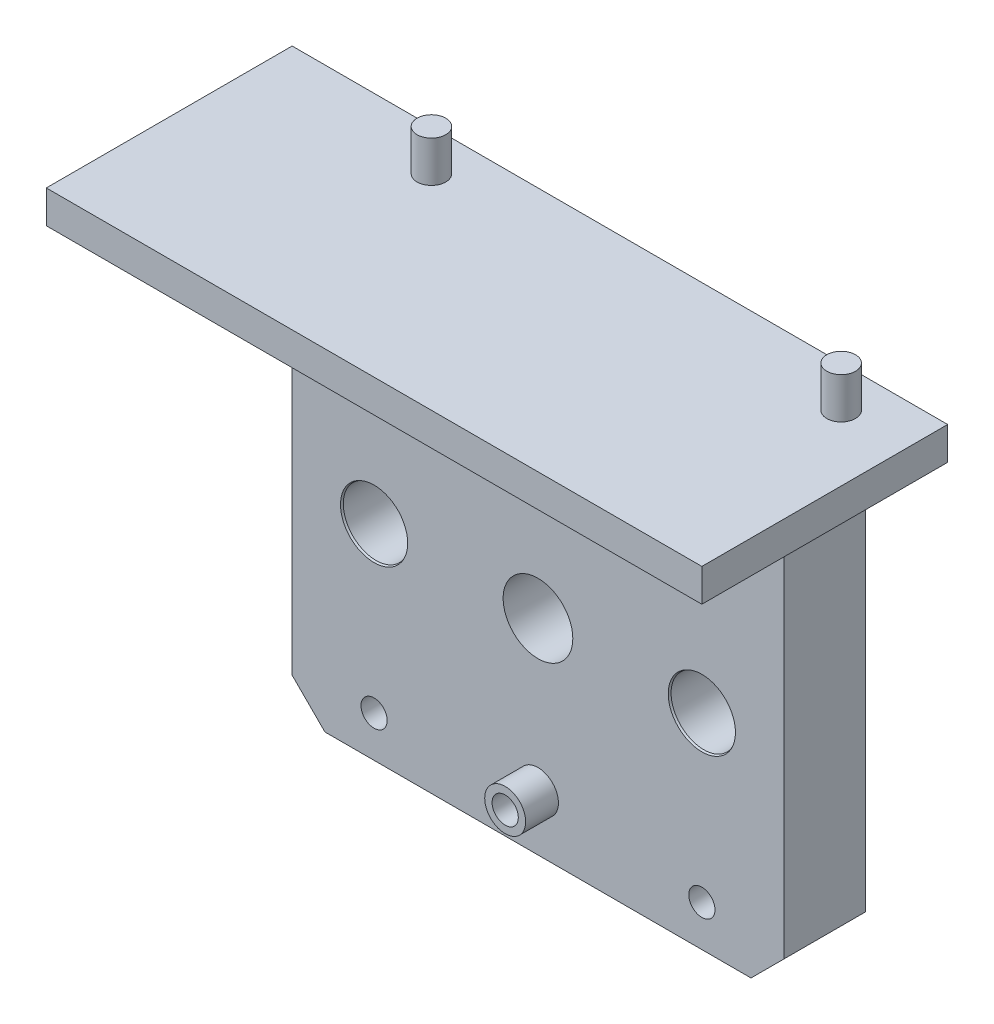
ISO-10303-21;
HEADER;
FILE_DESCRIPTION(('STEP AP214'),'2;1');
FILE_NAME('part.step','',(''),(''),'','','');
FILE_SCHEMA(('AUTOMOTIVE_DESIGN { 1 0 10303 214 1 1 1 1 }'));
ENDSEC;
DATA;
#1=APPLICATION_CONTEXT('core data for automotive mechanical design processes');
#2=APPLICATION_PROTOCOL_DEFINITION('international standard','automotive_design',2000,#1);
#3=PRODUCT_CONTEXT('',#1,'mechanical');
#4=PRODUCT('Part','Part','',(#3));
#5=PRODUCT_RELATED_PRODUCT_CATEGORY('part','',(#4));
#6=PRODUCT_DEFINITION_FORMATION('','',#4);
#7=PRODUCT_DEFINITION_CONTEXT('part definition',#1,'design');
#8=PRODUCT_DEFINITION('design','',#6,#7);
#9=PRODUCT_DEFINITION_SHAPE('','',#8);
#10=(LENGTH_UNIT() NAMED_UNIT(*) SI_UNIT(.MILLI.,.METRE.));
#11=(NAMED_UNIT(*) PLANE_ANGLE_UNIT() SI_UNIT($,.RADIAN.));
#12=(NAMED_UNIT(*) SI_UNIT($,.STERADIAN.) SOLID_ANGLE_UNIT());
#13=UNCERTAINTY_MEASURE_WITH_UNIT(LENGTH_MEASURE(1.E-05),#10,'distance_accuracy_value','');
#14=(GEOMETRIC_REPRESENTATION_CONTEXT(3) GLOBAL_UNCERTAINTY_ASSIGNED_CONTEXT((#13)) GLOBAL_UNIT_ASSIGNED_CONTEXT((#10,
#11,#12)) REPRESENTATION_CONTEXT('',''));
#15=CARTESIAN_POINT('',(0.,0.,0.));
#16=DIRECTION('',(0.,0.,1.));
#17=DIRECTION('',(1.,0.,0.));
#18=AXIS2_PLACEMENT_3D('',#15,#16,#17);
#19=CARTESIAN_POINT('',(0.,0.,10.));
#20=DIRECTION('',(0.,0.,-1.));
#21=DIRECTION('',(-1.,0.,0.));
#22=AXIS2_PLACEMENT_3D('',#19,#20,#21);
#23=PLANE('',#22);
#24=CARTESIAN_POINT('',(20.,-20.0000000000002,10.));
#25=DIRECTION('',(0.,0.,1.));
#26=DIRECTION('',(1.,0.,0.));
#27=AXIS2_PLACEMENT_3D('',#24,#25,#26);
#28=CIRCLE('',#27,1.6);
#29=CARTESIAN_POINT('',(21.6,-20.0000000000002,10.));
#30=VERTEX_POINT('',#29);
#31=EDGE_CURVE('E180',#30,#30,#28,.T.);
#32=ORIENTED_EDGE('',*,*,#31,.F.);
#33=EDGE_LOOP('',(#32));
#34=FACE_BOUND('',#33,.T.);
#35=CARTESIAN_POINT('',(-20.,20.0000000000002,10.));
#36=DIRECTION('',(0.,0.,1.));
#37=DIRECTION('',(1.,0.,0.));
#38=AXIS2_PLACEMENT_3D('',#35,#36,#37);
#39=CIRCLE('',#38,1.6);
#40=CARTESIAN_POINT('',(-18.4,20.0000000000002,10.));
#41=VERTEX_POINT('',#40);
#42=EDGE_CURVE('E176',#41,#41,#39,.T.);
#43=ORIENTED_EDGE('',*,*,#42,.F.);
#44=EDGE_LOOP('',(#43));
#45=FACE_BOUND('',#44,.T.);
#46=CARTESIAN_POINT('',(0.,-18.25,10.));
#47=DIRECTION('',(0.,0.,-1.));
#48=DIRECTION('',(-1.,0.,0.));
#49=AXIS2_PLACEMENT_3D('',#46,#47,#48);
#50=CIRCLE('',#49,2.5);
#51=CARTESIAN_POINT('',(-2.5,-18.25,10.));
#52=VERTEX_POINT('',#51);
#53=EDGE_CURVE('E254',#52,#52,#50,.F.);
#54=ORIENTED_EDGE('',*,*,#53,.F.);
#55=EDGE_LOOP('',(#54));
#56=FACE_BOUND('',#55,.T.);
#57=CARTESIAN_POINT('',(0.,18.25,10.));
#58=DIRECTION('',(0.,0.,-1.));
#59=DIRECTION('',(-1.,0.,0.));
#60=AXIS2_PLACEMENT_3D('',#57,#58,#59);
#61=CIRCLE('',#60,2.5);
#62=CARTESIAN_POINT('',(-2.5,18.25,10.));
#63=VERTEX_POINT('',#62);
#64=EDGE_CURVE('E246',#63,#63,#61,.F.);
#65=ORIENTED_EDGE('',*,*,#64,.F.);
#66=EDGE_LOOP('',(#65));
#67=FACE_BOUND('',#66,.T.);
#68=CARTESIAN_POINT('',(20.,0.,10.));
#69=DIRECTION('',(0.,0.,1.));
#70=DIRECTION('',(1.,0.,0.));
#71=AXIS2_PLACEMENT_3D('',#68,#69,#70);
#72=CIRCLE('',#71,4.1);
#73=CARTESIAN_POINT('',(24.1,0.,10.));
#74=VERTEX_POINT('',#73);
#75=EDGE_CURVE('E214',#74,#74,#72,.T.);
#76=ORIENTED_EDGE('',*,*,#75,.F.);
#77=EDGE_LOOP('',(#76));
#78=FACE_BOUND('',#77,.T.);
#79=CARTESIAN_POINT('',(-20.,0.,10.));
#80=DIRECTION('',(0.,0.,1.));
#81=DIRECTION('',(1.,0.,0.));
#82=AXIS2_PLACEMENT_3D('',#79,#80,#81);
#83=CIRCLE('',#82,4.1);
#84=CARTESIAN_POINT('',(-15.9,0.,10.));
#85=VERTEX_POINT('',#84);
#86=EDGE_CURVE('E223',#85,#85,#83,.T.);
#87=ORIENTED_EDGE('',*,*,#86,.F.);
#88=EDGE_LOOP('',(#87));
#89=FACE_BOUND('',#88,.T.);
#90=CARTESIAN_POINT('',(0.,0.,10.));
#91=DIRECTION('',(0.,0.,1.));
#92=DIRECTION('',(1.,0.,0.));
#93=AXIS2_PLACEMENT_3D('',#90,#91,#92);
#94=CIRCLE('',#93,4.25000000000002);
#95=CARTESIAN_POINT('',(4.25000000000002,0.,10.));
#96=VERTEX_POINT('',#95);
#97=EDGE_CURVE('E232',#96,#96,#94,.T.);
#98=ORIENTED_EDGE('',*,*,#97,.F.);
#99=EDGE_LOOP('',(#98));
#100=FACE_BOUND('',#99,.T.);
#101=DIRECTION('',(0.,1.,0.));
#102=VECTOR('',#101,1.);
#103=CARTESIAN_POINT('',(30.,-25.,10.));
#104=LINE('',#103,#102);
#105=CARTESIAN_POINT('',(30.,-21.,10.));
#106=VERTEX_POINT('',#105);
#107=CARTESIAN_POINT('',(30.,31.5,10.));
#108=VERTEX_POINT('',#107);
#109=EDGE_CURVE('E239',#106,#108,#104,.T.);
#110=ORIENTED_EDGE('',*,*,#109,.T.);
#111=DIRECTION('',(-1.,0.,0.));
#112=VECTOR('',#111,1.);
#113=CARTESIAN_POINT('',(0.,31.5,10.));
#114=LINE('',#113,#112);
#115=CARTESIAN_POINT('',(-30.,31.5,10.));
#116=VERTEX_POINT('',#115);
#117=EDGE_CURVE('E161',#108,#116,#114,.T.);
#118=ORIENTED_EDGE('',*,*,#117,.T.);
#119=DIRECTION('',(0.,-1.,0.));
#120=VECTOR('',#119,1.);
#121=CARTESIAN_POINT('',(-30.,-25.,10.));
#122=LINE('',#121,#120);
#123=CARTESIAN_POINT('',(-30.,-21.,10.));
#124=VERTEX_POINT('',#123);
#125=EDGE_CURVE('E53',#116,#124,#122,.T.);
#126=ORIENTED_EDGE('',*,*,#125,.T.);
#127=DIRECTION('',(-0.707106781186546,0.707106781186549,0.));
#128=VECTOR('',#127,1.);
#129=CARTESIAN_POINT('',(-26.,-25.,10.));
#130=LINE('',#129,#128);
#131=CARTESIAN_POINT('',(-26.,-25.,10.));
#132=VERTEX_POINT('',#131);
#133=EDGE_CURVE('E269',#124,#132,#130,.F.);
#134=ORIENTED_EDGE('',*,*,#133,.T.);
#135=DIRECTION('',(1.,0.,0.));
#136=VECTOR('',#135,1.);
#137=CARTESIAN_POINT('',(-30.,-25.,10.));
#138=LINE('',#137,#136);
#139=CARTESIAN_POINT('',(26.,-25.,10.));
#140=VERTEX_POINT('',#139);
#141=EDGE_CURVE('E244',#132,#140,#138,.T.);
#142=ORIENTED_EDGE('',*,*,#141,.T.);
#143=DIRECTION('',(-0.707106781186549,-0.707106781186546,0.));
#144=VECTOR('',#143,1.);
#145=CARTESIAN_POINT('',(30.,-21.,10.));
#146=LINE('',#145,#144);
#147=EDGE_CURVE('E271',#140,#106,#146,.F.);
#148=ORIENTED_EDGE('',*,*,#147,.T.);
#149=EDGE_LOOP('',(#110,#118,#126,#134,#142,#148));
#150=FACE_BOUND('',#149,.T.);
#151=CARTESIAN_POINT('',(20.,20.0000000000002,10.));
#152=DIRECTION('',(0.,0.,1.));
#153=DIRECTION('',(1.,0.,0.));
#154=AXIS2_PLACEMENT_3D('',#151,#152,#153);
#155=CIRCLE('',#154,1.6);
#156=CARTESIAN_POINT('',(21.6,20.0000000000002,10.));
#157=VERTEX_POINT('',#156);
#158=EDGE_CURVE('E173',#157,#157,#155,.F.);
#159=ORIENTED_EDGE('',*,*,#158,.T.);
#160=EDGE_LOOP('',(#159));
#161=FACE_BOUND('',#160,.T.);
#162=CARTESIAN_POINT('',(-20.,-20.0000000000002,10.));
#163=DIRECTION('',(0.,0.,-1.));
#164=DIRECTION('',(-1.,0.,0.));
#165=AXIS2_PLACEMENT_3D('',#162,#163,#164);
#166=CIRCLE('',#165,1.6);
#167=CARTESIAN_POINT('',(-21.6,-20.0000000000002,10.));
#168=VERTEX_POINT('',#167);
#169=EDGE_CURVE('E186',#168,#168,#166,.T.);
#170=ORIENTED_EDGE('',*,*,#169,.T.);
#171=EDGE_LOOP('',(#170));
#172=FACE_BOUND('',#171,.T.);
#173=ADVANCED_FACE('F37',(#34,#45,#56,#67,#78,#89,#100,#150,#161,#172),#23,.F.);
#174=CARTESIAN_POINT('',(0.,0.,0.));
#175=DIRECTION('',(0.,0.,-1.));
#176=DIRECTION('',(-1.,0.,0.));
#177=AXIS2_PLACEMENT_3D('',#174,#175,#176);
#178=PLANE('',#177);
#179=DIRECTION('',(0.,-1.,0.));
#180=VECTOR('',#179,1.);
#181=CARTESIAN_POINT('',(-30.,-25.,0.));
#182=LINE('',#181,#180);
#183=CARTESIAN_POINT('',(-30.,31.5,0.));
#184=VERTEX_POINT('',#183);
#185=CARTESIAN_POINT('',(-30.,-21.,0.));
#186=VERTEX_POINT('',#185);
#187=EDGE_CURVE('E249',#184,#186,#182,.T.);
#188=ORIENTED_EDGE('',*,*,#187,.F.);
#189=DIRECTION('',(-1.,0.,0.));
#190=VECTOR('',#189,1.);
#191=CARTESIAN_POINT('',(40.,31.5,0.));
#192=LINE('',#191,#190);
#193=CARTESIAN_POINT('',(-40.,31.5,0.));
#194=VERTEX_POINT('',#193);
#195=EDGE_CURVE('E153',#184,#194,#192,.T.);
#196=ORIENTED_EDGE('',*,*,#195,.T.);
#197=DIRECTION('',(0.,1.,0.));
#198=VECTOR('',#197,1.);
#199=CARTESIAN_POINT('',(-40.,31.5,0.));
#200=LINE('',#199,#198);
#201=CARTESIAN_POINT('',(-40.,35.5,0.));
#202=VERTEX_POINT('',#201);
#203=EDGE_CURVE('E143',#194,#202,#200,.T.);
#204=ORIENTED_EDGE('',*,*,#203,.T.);
#205=DIRECTION('',(-1.,0.,0.));
#206=VECTOR('',#205,1.);
#207=CARTESIAN_POINT('',(30.,35.5,0.));
#208=LINE('',#207,#206);
#209=CARTESIAN_POINT('',(40.,35.5,0.));
#210=VERTEX_POINT('',#209);
#211=EDGE_CURVE('E170',#210,#202,#208,.T.);
#212=ORIENTED_EDGE('',*,*,#211,.F.);
#213=DIRECTION('',(0.,1.,0.));
#214=VECTOR('',#213,1.);
#215=CARTESIAN_POINT('',(40.,31.5,0.));
#216=LINE('',#215,#214);
#217=CARTESIAN_POINT('',(40.,31.5,0.));
#218=VERTEX_POINT('',#217);
#219=EDGE_CURVE('E162',#218,#210,#216,.T.);
#220=ORIENTED_EDGE('',*,*,#219,.F.);
#221=CARTESIAN_POINT('',(30.,31.5,0.));
#222=VERTEX_POINT('',#221);
#223=EDGE_CURVE('E129',#218,#222,#192,.T.);
#224=ORIENTED_EDGE('',*,*,#223,.T.);
#225=DIRECTION('',(0.,1.,0.));
#226=VECTOR('',#225,1.);
#227=CARTESIAN_POINT('',(30.,-25.,0.));
#228=LINE('',#227,#226);
#229=CARTESIAN_POINT('',(30.,-21.,0.));
#230=VERTEX_POINT('',#229);
#231=EDGE_CURVE('E238',#230,#222,#228,.T.);
#232=ORIENTED_EDGE('',*,*,#231,.F.);
#233=DIRECTION('',(0.707106781186549,0.707106781186546,0.));
#234=VECTOR('',#233,1.);
#235=CARTESIAN_POINT('',(25.4999999999999,-25.5,0.));
#236=LINE('',#235,#234);
#237=CARTESIAN_POINT('',(26.,-25.,0.));
#238=VERTEX_POINT('',#237);
#239=EDGE_CURVE('E263',#230,#238,#236,.F.);
#240=ORIENTED_EDGE('',*,*,#239,.T.);
#241=DIRECTION('',(1.,0.,0.));
#242=VECTOR('',#241,1.);
#243=CARTESIAN_POINT('',(-30.,-25.,0.));
#244=LINE('',#243,#242);
#245=CARTESIAN_POINT('',(-26.,-25.,0.));
#246=VERTEX_POINT('',#245);
#247=EDGE_CURVE('E242',#246,#238,#244,.T.);
#248=ORIENTED_EDGE('',*,*,#247,.F.);
#249=DIRECTION('',(0.707106781186546,-0.707106781186549,0.));
#250=VECTOR('',#249,1.);
#251=CARTESIAN_POINT('',(-25.5000000000001,-25.5,0.));
#252=LINE('',#251,#250);
#253=EDGE_CURVE('E260',#246,#186,#252,.F.);
#254=ORIENTED_EDGE('',*,*,#253,.T.);
#255=EDGE_LOOP('',(#188,#196,#204,#212,#220,#224,#232,#240,#248,#254));
#256=FACE_BOUND('',#255,.T.);
#257=CARTESIAN_POINT('',(20.,20.0000000000002,0.));
#258=DIRECTION('',(0.,0.,1.));
#259=DIRECTION('',(1.,0.,0.));
#260=AXIS2_PLACEMENT_3D('',#257,#258,#259);
#261=CIRCLE('',#260,1.6);
#262=CARTESIAN_POINT('',(21.6,20.0000000000002,0.));
#263=VERTEX_POINT('',#262);
#264=EDGE_CURVE('E177',#263,#263,#261,.F.);
#265=ORIENTED_EDGE('',*,*,#264,.F.);
#266=EDGE_LOOP('',(#265));
#267=FACE_BOUND('',#266,.T.);
#268=CARTESIAN_POINT('',(-20.,20.0000000000002,0.));
#269=DIRECTION('',(0.,0.,1.));
#270=DIRECTION('',(1.,0.,0.));
#271=AXIS2_PLACEMENT_3D('',#268,#269,#270);
#272=CIRCLE('',#271,1.6);
#273=CARTESIAN_POINT('',(-18.4,20.0000000000002,0.));
#274=VERTEX_POINT('',#273);
#275=EDGE_CURVE('E191',#274,#274,#272,.T.);
#276=ORIENTED_EDGE('',*,*,#275,.T.);
#277=EDGE_LOOP('',(#276));
#278=FACE_BOUND('',#277,.T.);
#279=CARTESIAN_POINT('',(0.,18.25,0.));
#280=DIRECTION('',(0.,0.,1.));
#281=DIRECTION('',(1.,0.,0.));
#282=AXIS2_PLACEMENT_3D('',#279,#280,#281);
#283=CIRCLE('',#282,1.60000000000001);
#284=CARTESIAN_POINT('',(1.60000000000001,18.25,0.));
#285=VERTEX_POINT('',#284);
#286=EDGE_CURVE('E199',#285,#285,#283,.T.);
#287=ORIENTED_EDGE('',*,*,#286,.T.);
#288=EDGE_LOOP('',(#287));
#289=FACE_BOUND('',#288,.T.);
#290=CARTESIAN_POINT('',(0.,-18.25,0.));
#291=DIRECTION('',(0.,0.,1.));
#292=DIRECTION('',(1.,0.,0.));
#293=AXIS2_PLACEMENT_3D('',#290,#291,#292);
#294=CIRCLE('',#293,1.60000000000001);
#295=CARTESIAN_POINT('',(1.60000000000001,-18.25,0.));
#296=VERTEX_POINT('',#295);
#297=EDGE_CURVE('E205',#296,#296,#294,.T.);
#298=ORIENTED_EDGE('',*,*,#297,.T.);
#299=EDGE_LOOP('',(#298));
#300=FACE_BOUND('',#299,.T.);
#301=CARTESIAN_POINT('',(20.,0.,0.));
#302=DIRECTION('',(0.,0.,1.));
#303=DIRECTION('',(1.,0.,0.));
#304=AXIS2_PLACEMENT_3D('',#301,#302,#303);
#305=CIRCLE('',#304,4.);
#306=CARTESIAN_POINT('',(24.,0.,0.));
#307=VERTEX_POINT('',#306);
#308=EDGE_CURVE('E220',#307,#307,#305,.T.);
#309=ORIENTED_EDGE('',*,*,#308,.T.);
#310=EDGE_LOOP('',(#309));
#311=FACE_BOUND('',#310,.T.);
#312=CARTESIAN_POINT('',(-20.,0.,0.));
#313=DIRECTION('',(0.,0.,1.));
#314=DIRECTION('',(1.,0.,0.));
#315=AXIS2_PLACEMENT_3D('',#312,#313,#314);
#316=CIRCLE('',#315,4.);
#317=CARTESIAN_POINT('',(-16.,0.,0.));
#318=VERTEX_POINT('',#317);
#319=EDGE_CURVE('E229',#318,#318,#316,.T.);
#320=ORIENTED_EDGE('',*,*,#319,.T.);
#321=EDGE_LOOP('',(#320));
#322=FACE_BOUND('',#321,.T.);
#323=CARTESIAN_POINT('',(0.,0.,0.));
#324=DIRECTION('',(0.,0.,-1.));
#325=DIRECTION('',(-1.,0.,0.));
#326=AXIS2_PLACEMENT_3D('',#323,#324,#325);
#327=CIRCLE('',#326,4.25000000000001);
#328=CARTESIAN_POINT('',(-4.25000000000001,0.,0.));
#329=VERTEX_POINT('',#328);
#330=EDGE_CURVE('E235',#329,#329,#327,.T.);
#331=ORIENTED_EDGE('',*,*,#330,.F.);
#332=EDGE_LOOP('',(#331));
#333=FACE_BOUND('',#332,.T.);
#334=CARTESIAN_POINT('',(20.,-20.0000000000002,0.));
#335=DIRECTION('',(0.,0.,1.));
#336=DIRECTION('',(1.,0.,0.));
#337=AXIS2_PLACEMENT_3D('',#334,#335,#336);
#338=CIRCLE('',#337,1.6);
#339=CARTESIAN_POINT('',(21.6,-20.0000000000002,0.));
#340=VERTEX_POINT('',#339);
#341=EDGE_CURVE('E183',#340,#340,#338,.T.);
#342=ORIENTED_EDGE('',*,*,#341,.T.);
#343=EDGE_LOOP('',(#342));
#344=FACE_BOUND('',#343,.T.);
#345=CARTESIAN_POINT('',(-20.,-20.0000000000002,0.));
#346=DIRECTION('',(0.,0.,-1.));
#347=DIRECTION('',(-1.,0.,0.));
#348=AXIS2_PLACEMENT_3D('',#345,#346,#347);
#349=CIRCLE('',#348,1.6);
#350=CARTESIAN_POINT('',(-21.6,-20.0000000000002,0.));
#351=VERTEX_POINT('',#350);
#352=EDGE_CURVE('E172',#351,#351,#349,.T.);
#353=ORIENTED_EDGE('',*,*,#352,.F.);
#354=EDGE_LOOP('',(#353));
#355=FACE_BOUND('',#354,.T.);
#356=ADVANCED_FACE('F284',(#256,#267,#278,#289,#300,#311,#322,#333,#344,#355),#178,.T.);
#357=CARTESIAN_POINT('',(30.,-25.,10.));
#358=DIRECTION('',(-1.,0.,0.));
#359=DIRECTION('',(0.,0.,1.));
#360=AXIS2_PLACEMENT_3D('',#357,#358,#359);
#361=PLANE('',#360);
#362=ORIENTED_EDGE('',*,*,#231,.T.);
#363=DIRECTION('',(0.,0.,1.));
#364=VECTOR('',#363,1.);
#365=CARTESIAN_POINT('',(30.,31.5,10.));
#366=LINE('',#365,#364);
#367=EDGE_CURVE('E167',#222,#108,#366,.T.);
#368=ORIENTED_EDGE('',*,*,#367,.T.);
#369=ORIENTED_EDGE('',*,*,#109,.F.);
#370=DIRECTION('',(0.,0.,-1.));
#371=VECTOR('',#370,1.);
#372=CARTESIAN_POINT('',(30.,-21.,10.));
#373=LINE('',#372,#371);
#374=EDGE_CURVE('E257',#106,#230,#373,.T.);
#375=ORIENTED_EDGE('',*,*,#374,.T.);
#376=EDGE_LOOP('',(#362,#368,#369,#375));
#377=FACE_BOUND('',#376,.T.);
#378=ADVANCED_FACE('F292',(#377),#361,.F.);
#379=CARTESIAN_POINT('',(-30.,-25.,10.));
#380=DIRECTION('',(1.,0.,0.));
#381=DIRECTION('',(0.,0.,-1.));
#382=AXIS2_PLACEMENT_3D('',#379,#380,#381);
#383=PLANE('',#382);
#384=ORIENTED_EDGE('',*,*,#125,.F.);
#385=DIRECTION('',(0.,0.,-1.));
#386=VECTOR('',#385,1.);
#387=CARTESIAN_POINT('',(-30.,31.5,10.));
#388=LINE('',#387,#386);
#389=EDGE_CURVE('E11',#116,#184,#388,.T.);
#390=ORIENTED_EDGE('',*,*,#389,.T.);
#391=ORIENTED_EDGE('',*,*,#187,.T.);
#392=DIRECTION('',(0.,0.,1.));
#393=VECTOR('',#392,1.);
#394=CARTESIAN_POINT('',(-30.,-21.,10.));
#395=LINE('',#394,#393);
#396=EDGE_CURVE('E46',#186,#124,#395,.T.);
#397=ORIENTED_EDGE('',*,*,#396,.T.);
#398=EDGE_LOOP('',(#384,#390,#391,#397));
#399=FACE_BOUND('',#398,.T.);
#400=ADVANCED_FACE('F275',(#399),#383,.F.);
#401=CARTESIAN_POINT('',(-30.,-25.,10.));
#402=DIRECTION('',(0.,1.,0.));
#403=DIRECTION('',(0.,0.,1.));
#404=AXIS2_PLACEMENT_3D('',#401,#402,#403);
#405=PLANE('',#404);
#406=ORIENTED_EDGE('',*,*,#247,.T.);
#407=DIRECTION('',(0.,0.,1.));
#408=VECTOR('',#407,1.);
#409=CARTESIAN_POINT('',(26.,-25.,10.));
#410=LINE('',#409,#408);
#411=EDGE_CURVE('E61',#238,#140,#410,.T.);
#412=ORIENTED_EDGE('',*,*,#411,.T.);
#413=ORIENTED_EDGE('',*,*,#141,.F.);
#414=DIRECTION('',(0.,0.,-1.));
#415=VECTOR('',#414,1.);
#416=CARTESIAN_POINT('',(-26.,-25.,10.));
#417=LINE('',#416,#415);
#418=EDGE_CURVE('E265',#132,#246,#417,.T.);
#419=ORIENTED_EDGE('',*,*,#418,.T.);
#420=EDGE_LOOP('',(#406,#412,#413,#419));
#421=FACE_BOUND('',#420,.T.);
#422=ADVANCED_FACE('F281',(#421),#405,.F.);
#423=CARTESIAN_POINT('',(0.,0.,10.));
#424=DIRECTION('',(0.,0.,1.));
#425=DIRECTION('',(1.,0.,0.));
#426=AXIS2_PLACEMENT_3D('',#423,#424,#425);
#427=CYLINDRICAL_SURFACE('',#426,4.25000000000001);
#428=ORIENTED_EDGE('',*,*,#330,.T.);
#429=EDGE_LOOP('',(#428));
#430=FACE_BOUND('',#429,.T.);
#431=ORIENTED_EDGE('',*,*,#97,.T.);
#432=EDGE_LOOP('',(#431));
#433=FACE_BOUND('',#432,.T.);
#434=ADVANCED_FACE('F318',(#430,#433),#427,.F.);
#435=CARTESIAN_POINT('',(-20.,0.,10.));
#436=DIRECTION('',(0.,0.,1.));
#437=DIRECTION('',(1.,0.,0.));
#438=AXIS2_PLACEMENT_3D('',#435,#436,#437);
#439=CYLINDRICAL_SURFACE('',#438,4.00000000000001);
#440=ORIENTED_EDGE('',*,*,#319,.F.);
#441=EDGE_LOOP('',(#440));
#442=FACE_BOUND('',#441,.T.);
#443=CARTESIAN_POINT('',(-20.,0.,9.75857864376273));
#444=DIRECTION('',(0.,0.,1.));
#445=DIRECTION('',(1.,0.,0.));
#446=AXIS2_PLACEMENT_3D('',#443,#444,#445);
#447=CIRCLE('',#446,4.00000000000001);
#448=CARTESIAN_POINT('',(-16.,0.,9.75857864376273));
#449=VERTEX_POINT('',#448);
#450=EDGE_CURVE('E226',#449,#449,#447,.T.);
#451=ORIENTED_EDGE('',*,*,#450,.T.);
#452=EDGE_LOOP('',(#451));
#453=FACE_BOUND('',#452,.T.);
#454=ADVANCED_FACE('F375',(#442,#453),#439,.F.);
#455=CARTESIAN_POINT('',(-20.,0.,10.));
#456=DIRECTION('',(0.,0.,1.));
#457=DIRECTION('',(1.,0.,0.));
#458=AXIS2_PLACEMENT_3D('',#455,#456,#457);
#459=CONICAL_SURFACE('',#458,4.1,0.392699081698732);
#460=ORIENTED_EDGE('',*,*,#450,.F.);
#461=EDGE_LOOP('',(#460));
#462=FACE_BOUND('',#461,.T.);
#463=ORIENTED_EDGE('',*,*,#86,.T.);
#464=EDGE_LOOP('',(#463));
#465=FACE_BOUND('',#464,.T.);
#466=ADVANCED_FACE('F372',(#462,#465),#459,.F.);
#467=CARTESIAN_POINT('',(20.,0.,10.));
#468=DIRECTION('',(0.,0.,1.));
#469=DIRECTION('',(1.,0.,0.));
#470=AXIS2_PLACEMENT_3D('',#467,#468,#469);
#471=CYLINDRICAL_SURFACE('',#470,4.00000000000001);
#472=ORIENTED_EDGE('',*,*,#308,.F.);
#473=EDGE_LOOP('',(#472));
#474=FACE_BOUND('',#473,.T.);
#475=CARTESIAN_POINT('',(20.,0.,9.75857864376273));
#476=DIRECTION('',(0.,0.,1.));
#477=DIRECTION('',(1.,0.,0.));
#478=AXIS2_PLACEMENT_3D('',#475,#476,#477);
#479=CIRCLE('',#478,4.00000000000001);
#480=CARTESIAN_POINT('',(24.,0.,9.75857864376273));
#481=VERTEX_POINT('',#480);
#482=EDGE_CURVE('E217',#481,#481,#479,.T.);
#483=ORIENTED_EDGE('',*,*,#482,.T.);
#484=EDGE_LOOP('',(#483));
#485=FACE_BOUND('',#484,.T.);
#486=ADVANCED_FACE('F368',(#474,#485),#471,.F.);
#487=CARTESIAN_POINT('',(20.,0.,10.));
#488=DIRECTION('',(0.,0.,1.));
#489=DIRECTION('',(1.,0.,0.));
#490=AXIS2_PLACEMENT_3D('',#487,#488,#489);
#491=CONICAL_SURFACE('',#490,4.1,0.392699081698732);
#492=ORIENTED_EDGE('',*,*,#482,.F.);
#493=EDGE_LOOP('',(#492));
#494=FACE_BOUND('',#493,.T.);
#495=ORIENTED_EDGE('',*,*,#75,.T.);
#496=EDGE_LOOP('',(#495));
#497=FACE_BOUND('',#496,.T.);
#498=ADVANCED_FACE('F364',(#494,#497),#491,.F.);
#499=CARTESIAN_POINT('',(0.,18.25,14.));
#500=DIRECTION('',(0.,0.,-1.));
#501=DIRECTION('',(-1.,0.,0.));
#502=AXIS2_PLACEMENT_3D('',#499,#500,#501);
#503=CYLINDRICAL_SURFACE('',#502,2.5);
#504=CARTESIAN_POINT('',(0.,18.25,14.));
#505=DIRECTION('',(0.,0.,1.));
#506=DIRECTION('',(1.,0.,0.));
#507=AXIS2_PLACEMENT_3D('',#504,#505,#506);
#508=CIRCLE('',#507,2.5);
#509=CARTESIAN_POINT('',(2.5,18.25,14.));
#510=VERTEX_POINT('',#509);
#511=EDGE_CURVE('E211',#510,#510,#508,.T.);
#512=ORIENTED_EDGE('',*,*,#511,.F.);
#513=EDGE_LOOP('',(#512));
#514=FACE_BOUND('',#513,.T.);
#515=ORIENTED_EDGE('',*,*,#64,.T.);
#516=EDGE_LOOP('',(#515));
#517=FACE_BOUND('',#516,.T.);
#518=ADVANCED_FACE('F360',(#514,#517),#503,.T.);
#519=CARTESIAN_POINT('',(0.,18.25,14.));
#520=DIRECTION('',(0.,0.,1.));
#521=DIRECTION('',(1.,0.,0.));
#522=AXIS2_PLACEMENT_3D('',#519,#520,#521);
#523=PLANE('',#522);
#524=CARTESIAN_POINT('',(0.,18.25,14.));
#525=DIRECTION('',(0.,0.,1.));
#526=DIRECTION('',(1.,0.,0.));
#527=AXIS2_PLACEMENT_3D('',#524,#525,#526);
#528=CIRCLE('',#527,1.60000000000001);
#529=CARTESIAN_POINT('',(1.60000000000001,18.25,14.));
#530=VERTEX_POINT('',#529);
#531=EDGE_CURVE('E194',#530,#530,#528,.T.);
#532=ORIENTED_EDGE('',*,*,#531,.F.);
#533=EDGE_LOOP('',(#532));
#534=FACE_BOUND('',#533,.T.);
#535=ORIENTED_EDGE('',*,*,#511,.T.);
#536=EDGE_LOOP('',(#535));
#537=FACE_BOUND('',#536,.T.);
#538=ADVANCED_FACE('F356',(#534,#537),#523,.T.);
#539=CARTESIAN_POINT('',(0.,-18.25,14.));
#540=DIRECTION('',(0.,0.,-1.));
#541=DIRECTION('',(-1.,0.,0.));
#542=AXIS2_PLACEMENT_3D('',#539,#540,#541);
#543=CYLINDRICAL_SURFACE('',#542,2.5);
#544=CARTESIAN_POINT('',(0.,-18.25,14.));
#545=DIRECTION('',(0.,0.,1.));
#546=DIRECTION('',(1.,0.,0.));
#547=AXIS2_PLACEMENT_3D('',#544,#545,#546);
#548=CIRCLE('',#547,2.5);
#549=CARTESIAN_POINT('',(2.5,-18.25,14.));
#550=VERTEX_POINT('',#549);
#551=EDGE_CURVE('E208',#550,#550,#548,.T.);
#552=ORIENTED_EDGE('',*,*,#551,.F.);
#553=EDGE_LOOP('',(#552));
#554=FACE_BOUND('',#553,.T.);
#555=ORIENTED_EDGE('',*,*,#53,.T.);
#556=EDGE_LOOP('',(#555));
#557=FACE_BOUND('',#556,.T.);
#558=ADVANCED_FACE('F352',(#554,#557),#543,.T.);
#559=CARTESIAN_POINT('',(0.,-18.25,14.));
#560=DIRECTION('',(0.,0.,1.));
#561=DIRECTION('',(1.,0.,0.));
#562=AXIS2_PLACEMENT_3D('',#559,#560,#561);
#563=PLANE('',#562);
#564=CARTESIAN_POINT('',(0.,-18.25,14.));
#565=DIRECTION('',(0.,0.,1.));
#566=DIRECTION('',(1.,0.,0.));
#567=AXIS2_PLACEMENT_3D('',#564,#565,#566);
#568=CIRCLE('',#567,1.60000000000001);
#569=CARTESIAN_POINT('',(1.60000000000001,-18.25,14.));
#570=VERTEX_POINT('',#569);
#571=EDGE_CURVE('E202',#570,#570,#568,.T.);
#572=ORIENTED_EDGE('',*,*,#571,.F.);
#573=EDGE_LOOP('',(#572));
#574=FACE_BOUND('',#573,.T.);
#575=ORIENTED_EDGE('',*,*,#551,.T.);
#576=EDGE_LOOP('',(#575));
#577=FACE_BOUND('',#576,.T.);
#578=ADVANCED_FACE('F342',(#574,#577),#563,.T.);
#579=CARTESIAN_POINT('',(0.,-18.25,14.));
#580=DIRECTION('',(0.,0.,1.));
#581=DIRECTION('',(1.,0.,0.));
#582=AXIS2_PLACEMENT_3D('',#579,#580,#581);
#583=CYLINDRICAL_SURFACE('',#582,1.60000000000001);
#584=ORIENTED_EDGE('',*,*,#297,.F.);
#585=EDGE_LOOP('',(#584));
#586=FACE_BOUND('',#585,.T.);
#587=ORIENTED_EDGE('',*,*,#571,.T.);
#588=EDGE_LOOP('',(#587));
#589=FACE_BOUND('',#588,.T.);
#590=ADVANCED_FACE('F336',(#586,#589),#583,.F.);
#591=CARTESIAN_POINT('',(0.,18.25,14.));
#592=DIRECTION('',(0.,0.,1.));
#593=DIRECTION('',(1.,0.,0.));
#594=AXIS2_PLACEMENT_3D('',#591,#592,#593);
#595=CYLINDRICAL_SURFACE('',#594,1.60000000000001);
#596=ORIENTED_EDGE('',*,*,#286,.F.);
#597=EDGE_LOOP('',(#596));
#598=FACE_BOUND('',#597,.T.);
#599=ORIENTED_EDGE('',*,*,#531,.T.);
#600=EDGE_LOOP('',(#599));
#601=FACE_BOUND('',#600,.T.);
#602=ADVANCED_FACE('F330',(#598,#601),#595,.F.);
#603=CARTESIAN_POINT('',(30.,-21.,10.));
#604=DIRECTION('',(-0.707106781186546,0.707106781186549,0.));
#605=DIRECTION('',(0.,0.,-1.));
#606=AXIS2_PLACEMENT_3D('',#603,#604,#605);
#607=PLANE('',#606);
#608=ORIENTED_EDGE('',*,*,#147,.F.);
#609=ORIENTED_EDGE('',*,*,#411,.F.);
#610=ORIENTED_EDGE('',*,*,#239,.F.);
#611=ORIENTED_EDGE('',*,*,#374,.F.);
#612=EDGE_LOOP('',(#608,#609,#610,#611));
#613=FACE_BOUND('',#612,.T.);
#614=ADVANCED_FACE('F289',(#613),#607,.F.);
#615=CARTESIAN_POINT('',(-26.,-25.,10.));
#616=DIRECTION('',(0.707106781186549,0.707106781186546,0.));
#617=DIRECTION('',(0.,0.,-1.));
#618=AXIS2_PLACEMENT_3D('',#615,#616,#617);
#619=PLANE('',#618);
#620=ORIENTED_EDGE('',*,*,#133,.F.);
#621=ORIENTED_EDGE('',*,*,#396,.F.);
#622=ORIENTED_EDGE('',*,*,#253,.F.);
#623=ORIENTED_EDGE('',*,*,#418,.F.);
#624=EDGE_LOOP('',(#620,#621,#622,#623));
#625=FACE_BOUND('',#624,.T.);
#626=ADVANCED_FACE('F40',(#625),#619,.F.);
#627=CARTESIAN_POINT('',(-20.,20.0000000000002,0.));
#628=DIRECTION('',(0.,0.,1.));
#629=DIRECTION('',(1.,0.,0.));
#630=AXIS2_PLACEMENT_3D('',#627,#628,#629);
#631=CYLINDRICAL_SURFACE('',#630,1.6);
#632=ORIENTED_EDGE('',*,*,#275,.F.);
#633=EDGE_LOOP('',(#632));
#634=FACE_BOUND('',#633,.T.);
#635=ORIENTED_EDGE('',*,*,#42,.T.);
#636=EDGE_LOOP('',(#635));
#637=FACE_BOUND('',#636,.T.);
#638=ADVANCED_FACE('F335',(#634,#637),#631,.F.);
#639=CARTESIAN_POINT('',(20.,20.0000000000002,0.));
#640=DIRECTION('',(0.,0.,1.));
#641=DIRECTION('',(1.,0.,0.));
#642=AXIS2_PLACEMENT_3D('',#639,#640,#641);
#643=CYLINDRICAL_SURFACE('',#642,1.6);
#644=ORIENTED_EDGE('',*,*,#264,.T.);
#645=EDGE_LOOP('',(#644));
#646=FACE_BOUND('',#645,.T.);
#647=ORIENTED_EDGE('',*,*,#158,.F.);
#648=EDGE_LOOP('',(#647));
#649=FACE_BOUND('',#648,.T.);
#650=ADVANCED_FACE('F412',(#646,#649),#643,.F.);
#651=CARTESIAN_POINT('',(20.,-20.0000000000002,0.));
#652=DIRECTION('',(0.,0.,1.));
#653=DIRECTION('',(1.,0.,0.));
#654=AXIS2_PLACEMENT_3D('',#651,#652,#653);
#655=CYLINDRICAL_SURFACE('',#654,1.6);
#656=ORIENTED_EDGE('',*,*,#341,.F.);
#657=EDGE_LOOP('',(#656));
#658=FACE_BOUND('',#657,.T.);
#659=ORIENTED_EDGE('',*,*,#31,.T.);
#660=EDGE_LOOP('',(#659));
#661=FACE_BOUND('',#660,.T.);
#662=ADVANCED_FACE('F403',(#658,#661),#655,.F.);
#663=CARTESIAN_POINT('',(-20.,-20.0000000000002,0.));
#664=DIRECTION('',(0.,0.,1.));
#665=DIRECTION('',(1.,0.,0.));
#666=AXIS2_PLACEMENT_3D('',#663,#664,#665);
#667=CYLINDRICAL_SURFACE('',#666,1.6);
#668=ORIENTED_EDGE('',*,*,#352,.T.);
#669=EDGE_LOOP('',(#668));
#670=FACE_BOUND('',#669,.T.);
#671=ORIENTED_EDGE('',*,*,#169,.F.);
#672=EDGE_LOOP('',(#671));
#673=FACE_BOUND('',#672,.T.);
#674=ADVANCED_FACE('F400',(#670,#673),#667,.F.);
#675=CARTESIAN_POINT('',(0.,35.5,0.));
#676=DIRECTION('',(0.,1.,0.));
#677=DIRECTION('',(0.,0.,1.));
#678=AXIS2_PLACEMENT_3D('',#675,#676,#677);
#679=PLANE('',#678);
#680=CARTESIAN_POINT('',(31.9999999999999,35.5,4.99999999999998));
#681=DIRECTION('',(0.,1.,0.));
#682=DIRECTION('',(0.,0.,1.));
#683=AXIS2_PLACEMENT_3D('',#680,#681,#682);
#684=CIRCLE('',#683,1.75);
#685=CARTESIAN_POINT('',(31.9999999999999,35.5,6.74999999999998));
#686=VERTEX_POINT('',#685);
#687=EDGE_CURVE('E655',#686,#686,#684,.T.);
#688=ORIENTED_EDGE('',*,*,#687,.F.);
#689=EDGE_LOOP('',(#688));
#690=FACE_BOUND('',#689,.T.);
#691=CARTESIAN_POINT('',(-18.0000000000002,35.5,4.99999999999999));
#692=DIRECTION('',(0.,1.,0.));
#693=DIRECTION('',(0.,0.,1.));
#694=AXIS2_PLACEMENT_3D('',#691,#692,#693);
#695=CIRCLE('',#694,1.75);
#696=CARTESIAN_POINT('',(-18.0000000000002,35.5,6.74999999999999));
#697=VERTEX_POINT('',#696);
#698=EDGE_CURVE('E149',#697,#697,#695,.T.);
#699=ORIENTED_EDGE('',*,*,#698,.F.);
#700=EDGE_LOOP('',(#699));
#701=FACE_BOUND('',#700,.T.);
#702=DIRECTION('',(0.,0.,-1.));
#703=VECTOR('',#702,1.);
#704=CARTESIAN_POINT('',(40.,35.5,0.));
#705=LINE('',#704,#703);
#706=CARTESIAN_POINT('',(40.,35.5,30.));
#707=VERTEX_POINT('',#706);
#708=EDGE_CURVE('E144',#707,#210,#705,.T.);
#709=ORIENTED_EDGE('',*,*,#708,.T.);
#710=ORIENTED_EDGE('',*,*,#211,.T.);
#711=DIRECTION('',(0.,0.,1.));
#712=VECTOR('',#711,1.);
#713=CARTESIAN_POINT('',(-40.,35.5,0.));
#714=LINE('',#713,#712);
#715=CARTESIAN_POINT('',(-40.,35.5,30.));
#716=VERTEX_POINT('',#715);
#717=EDGE_CURVE('E156',#202,#716,#714,.T.);
#718=ORIENTED_EDGE('',*,*,#717,.T.);
#719=DIRECTION('',(1.,0.,0.));
#720=VECTOR('',#719,1.);
#721=CARTESIAN_POINT('',(40.,35.5,30.));
#722=LINE('',#721,#720);
#723=EDGE_CURVE('E123',#716,#707,#722,.T.);
#724=ORIENTED_EDGE('',*,*,#723,.T.);
#725=EDGE_LOOP('',(#709,#710,#718,#724));
#726=FACE_BOUND('',#725,.T.);
#727=ADVANCED_FACE('F294',(#690,#701,#726),#679,.T.);
#728=CARTESIAN_POINT('',(0.,31.5,0.));
#729=DIRECTION('',(0.,-1.,0.));
#730=DIRECTION('',(0.,0.,-1.));
#731=AXIS2_PLACEMENT_3D('',#728,#729,#730);
#732=PLANE('',#731);
#733=ORIENTED_EDGE('',*,*,#367,.F.);
#734=ORIENTED_EDGE('',*,*,#223,.F.);
#735=DIRECTION('',(0.,0.,-1.));
#736=VECTOR('',#735,1.);
#737=CARTESIAN_POINT('',(40.,31.5,0.));
#738=LINE('',#737,#736);
#739=CARTESIAN_POINT('',(40.,31.5,30.));
#740=VERTEX_POINT('',#739);
#741=EDGE_CURVE('E138',#740,#218,#738,.T.);
#742=ORIENTED_EDGE('',*,*,#741,.F.);
#743=DIRECTION('',(1.,0.,0.));
#744=VECTOR('',#743,1.);
#745=CARTESIAN_POINT('',(40.,31.5,30.));
#746=LINE('',#745,#744);
#747=CARTESIAN_POINT('',(-40.,31.5,30.));
#748=VERTEX_POINT('',#747);
#749=EDGE_CURVE('E121',#748,#740,#746,.T.);
#750=ORIENTED_EDGE('',*,*,#749,.F.);
#751=DIRECTION('',(0.,0.,1.));
#752=VECTOR('',#751,1.);
#753=CARTESIAN_POINT('',(-40.,31.5,0.));
#754=LINE('',#753,#752);
#755=EDGE_CURVE('E135',#194,#748,#754,.T.);
#756=ORIENTED_EDGE('',*,*,#755,.F.);
#757=ORIENTED_EDGE('',*,*,#195,.F.);
#758=ORIENTED_EDGE('',*,*,#389,.F.);
#759=ORIENTED_EDGE('',*,*,#117,.F.);
#760=EDGE_LOOP('',(#733,#734,#742,#750,#756,#757,#758,#759));
#761=FACE_BOUND('',#760,.T.);
#762=ADVANCED_FACE('F134',(#761),#732,.T.);
#763=CARTESIAN_POINT('',(-40.,31.5,0.));
#764=DIRECTION('',(-1.,0.,0.));
#765=DIRECTION('',(0.,0.,1.));
#766=AXIS2_PLACEMENT_3D('',#763,#764,#765);
#767=PLANE('',#766);
#768=ORIENTED_EDGE('',*,*,#717,.F.);
#769=ORIENTED_EDGE('',*,*,#203,.F.);
#770=ORIENTED_EDGE('',*,*,#755,.T.);
#771=DIRECTION('',(0.,1.,0.));
#772=VECTOR('',#771,1.);
#773=CARTESIAN_POINT('',(-40.,31.5,30.));
#774=LINE('',#773,#772);
#775=EDGE_CURVE('E118',#748,#716,#774,.T.);
#776=ORIENTED_EDGE('',*,*,#775,.T.);
#777=EDGE_LOOP('',(#768,#769,#770,#776));
#778=FACE_BOUND('',#777,.T.);
#779=ADVANCED_FACE('F141',(#778),#767,.T.);
#780=CARTESIAN_POINT('',(40.,31.5,0.));
#781=DIRECTION('',(1.,0.,0.));
#782=DIRECTION('',(0.,0.,-1.));
#783=AXIS2_PLACEMENT_3D('',#780,#781,#782);
#784=PLANE('',#783);
#785=ORIENTED_EDGE('',*,*,#708,.F.);
#786=DIRECTION('',(0.,1.,0.));
#787=VECTOR('',#786,1.);
#788=CARTESIAN_POINT('',(40.,31.5,30.));
#789=LINE('',#788,#787);
#790=EDGE_CURVE('E128',#740,#707,#789,.T.);
#791=ORIENTED_EDGE('',*,*,#790,.F.);
#792=ORIENTED_EDGE('',*,*,#741,.T.);
#793=ORIENTED_EDGE('',*,*,#219,.T.);
#794=EDGE_LOOP('',(#785,#791,#792,#793));
#795=FACE_BOUND('',#794,.T.);
#796=ADVANCED_FACE('F297',(#795),#784,.T.);
#797=CARTESIAN_POINT('',(40.,31.5,30.));
#798=DIRECTION('',(0.,0.,1.));
#799=DIRECTION('',(1.,0.,0.));
#800=AXIS2_PLACEMENT_3D('',#797,#798,#799);
#801=PLANE('',#800);
#802=ORIENTED_EDGE('',*,*,#723,.F.);
#803=ORIENTED_EDGE('',*,*,#775,.F.);
#804=ORIENTED_EDGE('',*,*,#749,.T.);
#805=ORIENTED_EDGE('',*,*,#790,.T.);
#806=EDGE_LOOP('',(#802,#803,#804,#805));
#807=FACE_BOUND('',#806,.T.);
#808=ADVANCED_FACE('F120',(#807),#801,.T.);
#809=CARTESIAN_POINT('',(-18.0000000000002,40.5,4.99999999999999));
#810=DIRECTION('',(0.,-1.,0.));
#811=DIRECTION('',(0.,0.,-1.));
#812=AXIS2_PLACEMENT_3D('',#809,#810,#811);
#813=CYLINDRICAL_SURFACE('',#812,1.75);
#814=CARTESIAN_POINT('',(-18.0000000000002,40.5,4.99999999999999));
#815=DIRECTION('',(0.,1.,0.));
#816=DIRECTION('',(0.,0.,1.));
#817=AXIS2_PLACEMENT_3D('',#814,#815,#816);
#818=CIRCLE('',#817,1.75);
#819=CARTESIAN_POINT('',(-18.0000000000002,40.5,6.74999999999999));
#820=VERTEX_POINT('',#819);
#821=EDGE_CURVE('E158',#820,#820,#818,.T.);
#822=ORIENTED_EDGE('',*,*,#821,.F.);
#823=EDGE_LOOP('',(#822));
#824=FACE_BOUND('',#823,.T.);
#825=ORIENTED_EDGE('',*,*,#698,.T.);
#826=EDGE_LOOP('',(#825));
#827=FACE_BOUND('',#826,.T.);
#828=ADVANCED_FACE('F304',(#824,#827),#813,.T.);
#829=CARTESIAN_POINT('',(-18.0000000000002,40.5,4.99999999999999));
#830=DIRECTION('',(0.,1.,0.));
#831=DIRECTION('',(0.,0.,1.));
#832=AXIS2_PLACEMENT_3D('',#829,#830,#831);
#833=PLANE('',#832);
#834=ORIENTED_EDGE('',*,*,#821,.T.);
#835=EDGE_LOOP('',(#834));
#836=FACE_BOUND('',#835,.T.);
#837=ADVANCED_FACE('F618',(#836),#833,.T.);
#838=CARTESIAN_POINT('',(31.9999999999999,40.5,4.99999999999998));
#839=DIRECTION('',(0.,-1.,0.));
#840=DIRECTION('',(0.,0.,-1.));
#841=AXIS2_PLACEMENT_3D('',#838,#839,#840);
#842=CYLINDRICAL_SURFACE('',#841,1.75);
#843=CARTESIAN_POINT('',(31.9999999999999,40.5,4.99999999999998));
#844=DIRECTION('',(0.,1.,0.));
#845=DIRECTION('',(0.,0.,1.));
#846=AXIS2_PLACEMENT_3D('',#843,#844,#845);
#847=CIRCLE('',#846,1.75);
#848=CARTESIAN_POINT('',(31.9999999999999,40.5,6.74999999999998));
#849=VERTEX_POINT('',#848);
#850=EDGE_CURVE('E654',#849,#849,#847,.T.);
#851=ORIENTED_EDGE('',*,*,#850,.F.);
#852=EDGE_LOOP('',(#851));
#853=FACE_BOUND('',#852,.T.);
#854=ORIENTED_EDGE('',*,*,#687,.T.);
#855=EDGE_LOOP('',(#854));
#856=FACE_BOUND('',#855,.T.);
#857=ADVANCED_FACE('F627',(#853,#856),#842,.T.);
#858=CARTESIAN_POINT('',(31.9999999999999,40.5,4.99999999999998));
#859=DIRECTION('',(0.,1.,0.));
#860=DIRECTION('',(0.,0.,1.));
#861=AXIS2_PLACEMENT_3D('',#858,#859,#860);
#862=PLANE('',#861);
#863=ORIENTED_EDGE('',*,*,#850,.T.);
#864=EDGE_LOOP('',(#863));
#865=FACE_BOUND('',#864,.T.);
#866=ADVANCED_FACE('F636',(#865),#862,.T.);
#867=CLOSED_SHELL('',(#173,#356,#378,#400,#422,#434,#454,#466,#486,#498,#518,#538,#558,#578,
#590,#602,#614,#626,#638,#650,#662,#674,#727,#762,#779,#796,#808,#828,#837,#857,#866));
#868=MANIFOLD_SOLID_BREP('B2',#867);
#869=ADVANCED_BREP_SHAPE_REPRESENTATION('',(#18,#868),#14);
#870=SHAPE_DEFINITION_REPRESENTATION(#9,#869);
ENDSEC;
END-ISO-10303-21;
